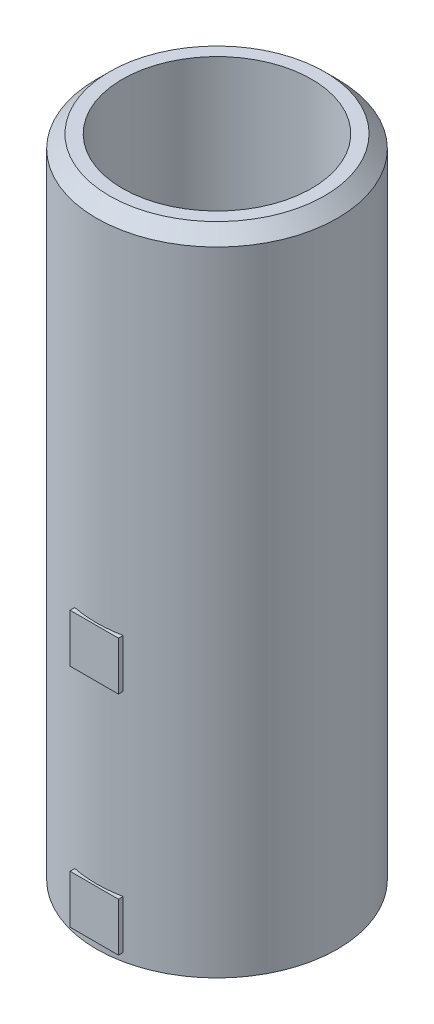
ISO-10303-21;
HEADER;
FILE_DESCRIPTION(('STEP AP214'),'2;1');
FILE_NAME('part.step','',(''),(''),'','','');
FILE_SCHEMA(('AUTOMOTIVE_DESIGN { 1 0 10303 214 1 1 1 1 }'));
ENDSEC;
DATA;
#1=APPLICATION_CONTEXT('core data for automotive mechanical design processes');
#2=APPLICATION_PROTOCOL_DEFINITION('international standard','automotive_design',2000,#1);
#3=PRODUCT_CONTEXT('',#1,'mechanical');
#4=PRODUCT('Part','Part','',(#3));
#5=PRODUCT_RELATED_PRODUCT_CATEGORY('part','',(#4));
#6=PRODUCT_DEFINITION_FORMATION('','',#4);
#7=PRODUCT_DEFINITION_CONTEXT('part definition',#1,'design');
#8=PRODUCT_DEFINITION('design','',#6,#7);
#9=PRODUCT_DEFINITION_SHAPE('','',#8);
#10=(LENGTH_UNIT() NAMED_UNIT(*) SI_UNIT(.MILLI.,.METRE.));
#11=(NAMED_UNIT(*) PLANE_ANGLE_UNIT() SI_UNIT($,.RADIAN.));
#12=(NAMED_UNIT(*) SI_UNIT($,.STERADIAN.) SOLID_ANGLE_UNIT());
#13=UNCERTAINTY_MEASURE_WITH_UNIT(LENGTH_MEASURE(1.E-05),#10,'distance_accuracy_value','');
#14=(GEOMETRIC_REPRESENTATION_CONTEXT(3) GLOBAL_UNCERTAINTY_ASSIGNED_CONTEXT((#13)) GLOBAL_UNIT_ASSIGNED_CONTEXT((#10,
#11,#12)) REPRESENTATION_CONTEXT('',''));
#15=CARTESIAN_POINT('',(0.,0.,0.));
#16=DIRECTION('',(0.,0.,1.));
#17=DIRECTION('',(1.,0.,0.));
#18=AXIS2_PLACEMENT_3D('',#15,#16,#17);
#19=CARTESIAN_POINT('',(0.,100.,0.));
#20=DIRECTION('',(0.,-1.,0.));
#21=DIRECTION('',(0.,0.,-1.));
#22=AXIS2_PLACEMENT_3D('',#19,#20,#21);
#23=CYLINDRICAL_SURFACE('',#22,18.65);
#24=CARTESIAN_POINT('',(0.,98.,0.));
#25=DIRECTION('',(0.,1.,0.));
#26=DIRECTION('',(0.,0.,1.));
#27=AXIS2_PLACEMENT_3D('',#24,#25,#26);
#28=CIRCLE('',#27,18.65);
#29=CARTESIAN_POINT('',(0.,98.,18.65));
#30=VERTEX_POINT('',#29);
#31=EDGE_CURVE('E11',#30,#30,#28,.F.);
#32=ORIENTED_EDGE('',*,*,#31,.T.);
#33=EDGE_LOOP('',(#32));
#34=FACE_BOUND('',#33,.T.);
#35=DIRECTION('',(0.,-1.,0.));
#36=VECTOR('',#35,1.);
#37=CARTESIAN_POINT('',(3.74999999999998,100.,18.2690995946708));
#38=LINE('',#37,#36);
#39=CARTESIAN_POINT('',(3.75,1.25,18.2690995946708));
#40=VERTEX_POINT('',#39);
#41=CARTESIAN_POINT('',(3.75,8.75000000000001,18.2690995946708));
#42=VERTEX_POINT('',#41);
#43=EDGE_CURVE('E164',#40,#42,#38,.F.);
#44=ORIENTED_EDGE('',*,*,#43,.F.);
#45=CARTESIAN_POINT('',(0.,1.25,0.));
#46=DIRECTION('',(0.,-1.,0.));
#47=DIRECTION('',(1.,0.,0.));
#48=AXIS2_PLACEMENT_3D('',#45,#46,#47);
#49=CIRCLE('',#48,18.65);
#50=CARTESIAN_POINT('',(-3.75,1.25,18.2690995946708));
#51=VERTEX_POINT('',#50);
#52=EDGE_CURVE('E168',#51,#40,#49,.F.);
#53=ORIENTED_EDGE('',*,*,#52,.F.);
#54=DIRECTION('',(0.,-1.,0.));
#55=VECTOR('',#54,1.);
#56=CARTESIAN_POINT('',(-3.75000000000002,100.,18.2690995946708));
#57=LINE('',#56,#55);
#58=CARTESIAN_POINT('',(-3.75000000000002,8.75000000000001,18.2690995946708));
#59=VERTEX_POINT('',#58);
#60=EDGE_CURVE('E175',#59,#51,#57,.T.);
#61=ORIENTED_EDGE('',*,*,#60,.F.);
#62=CARTESIAN_POINT('',(0.,8.75000000000001,0.));
#63=DIRECTION('',(0.,1.,0.));
#64=DIRECTION('',(0.,0.,1.));
#65=AXIS2_PLACEMENT_3D('',#62,#63,#64);
#66=CIRCLE('',#65,18.65);
#67=EDGE_CURVE('E169',#42,#59,#66,.F.);
#68=ORIENTED_EDGE('',*,*,#67,.F.);
#69=EDGE_LOOP('',(#44,#53,#61,#68));
#70=FACE_BOUND('',#69,.T.);
#71=CARTESIAN_POINT('',(0.,0.,0.));
#72=DIRECTION('',(0.,1.,0.));
#73=DIRECTION('',(0.,0.,1.));
#74=AXIS2_PLACEMENT_3D('',#71,#72,#73);
#75=CIRCLE('',#74,18.65);
#76=CARTESIAN_POINT('',(0.,0.,18.65));
#77=VERTEX_POINT('',#76);
#78=EDGE_CURVE('E233',#77,#77,#75,.T.);
#79=ORIENTED_EDGE('',*,*,#78,.T.);
#80=EDGE_LOOP('',(#79));
#81=FACE_BOUND('',#80,.T.);
#82=DIRECTION('',(0.,-1.,0.));
#83=VECTOR('',#82,1.);
#84=CARTESIAN_POINT('',(3.75,100.,18.2690995946708));
#85=LINE('',#84,#83);
#86=CARTESIAN_POINT('',(3.75,36.25,18.2690995946708));
#87=VERTEX_POINT('',#86);
#88=CARTESIAN_POINT('',(3.75,43.75,18.2690995946708));
#89=VERTEX_POINT('',#88);
#90=EDGE_CURVE('E166',#87,#89,#85,.F.);
#91=ORIENTED_EDGE('',*,*,#90,.F.);
#92=CARTESIAN_POINT('',(0.,36.25,0.));
#93=DIRECTION('',(0.,-1.,0.));
#94=DIRECTION('',(0.,0.,-1.));
#95=AXIS2_PLACEMENT_3D('',#92,#93,#94);
#96=CIRCLE('',#95,18.65);
#97=CARTESIAN_POINT('',(-3.75,36.25,18.2690995946708));
#98=VERTEX_POINT('',#97);
#99=EDGE_CURVE('E219',#98,#87,#96,.F.);
#100=ORIENTED_EDGE('',*,*,#99,.F.);
#101=DIRECTION('',(0.,-1.,0.));
#102=VECTOR('',#101,1.);
#103=CARTESIAN_POINT('',(-3.75,100.,18.2690995946708));
#104=LINE('',#103,#102);
#105=CARTESIAN_POINT('',(-3.75,43.75,18.2690995946708));
#106=VERTEX_POINT('',#105);
#107=EDGE_CURVE('E221',#106,#98,#104,.T.);
#108=ORIENTED_EDGE('',*,*,#107,.F.);
#109=CARTESIAN_POINT('',(0.,43.75,0.));
#110=DIRECTION('',(0.,1.,0.));
#111=DIRECTION('',(0.,0.,1.));
#112=AXIS2_PLACEMENT_3D('',#109,#110,#111);
#113=CIRCLE('',#112,18.65);
#114=EDGE_CURVE('E222',#89,#106,#113,.F.);
#115=ORIENTED_EDGE('',*,*,#114,.F.);
#116=EDGE_LOOP('',(#91,#100,#108,#115));
#117=FACE_BOUND('',#116,.T.);
#118=DIRECTION('',(0.,-1.,0.));
#119=VECTOR('',#118,1.);
#120=CARTESIAN_POINT('',(-3.75,100.,-18.2690995946708));
#121=LINE('',#120,#119);
#122=CARTESIAN_POINT('',(-3.75,36.25,-18.2690995946708));
#123=VERTEX_POINT('',#122);
#124=CARTESIAN_POINT('',(-3.75,43.75,-18.2690995946708));
#125=VERTEX_POINT('',#124);
#126=EDGE_CURVE('E126',#123,#125,#121,.F.);
#127=ORIENTED_EDGE('',*,*,#126,.F.);
#128=CARTESIAN_POINT('',(0.,36.25,0.));
#129=DIRECTION('',(0.,-1.,0.));
#130=DIRECTION('',(0.,0.,-1.));
#131=AXIS2_PLACEMENT_3D('',#128,#129,#130);
#132=CIRCLE('',#131,18.65);
#133=CARTESIAN_POINT('',(3.75,36.25,-18.2690995946708));
#134=VERTEX_POINT('',#133);
#135=EDGE_CURVE('E133',#134,#123,#132,.F.);
#136=ORIENTED_EDGE('',*,*,#135,.F.);
#137=DIRECTION('',(0.,-1.,0.));
#138=VECTOR('',#137,1.);
#139=CARTESIAN_POINT('',(3.75,100.,-18.2690995946708));
#140=LINE('',#139,#138);
#141=CARTESIAN_POINT('',(3.75,43.75,-18.2690995946708));
#142=VERTEX_POINT('',#141);
#143=EDGE_CURVE('E64',#142,#134,#140,.T.);
#144=ORIENTED_EDGE('',*,*,#143,.F.);
#145=CARTESIAN_POINT('',(0.,43.75,0.));
#146=DIRECTION('',(0.,1.,0.));
#147=DIRECTION('',(0.,0.,1.));
#148=AXIS2_PLACEMENT_3D('',#145,#146,#147);
#149=CIRCLE('',#148,18.65);
#150=EDGE_CURVE('E60',#125,#142,#149,.F.);
#151=ORIENTED_EDGE('',*,*,#150,.F.);
#152=EDGE_LOOP('',(#127,#136,#144,#151));
#153=FACE_BOUND('',#152,.T.);
#154=ADVANCED_FACE('F41',(#34,#70,#81,#117,#153),#23,.T.);
#155=CARTESIAN_POINT('',(0.,100.,0.));
#156=DIRECTION('',(0.,1.,0.));
#157=DIRECTION('',(0.,0.,1.));
#158=AXIS2_PLACEMENT_3D('',#155,#156,#157);
#159=PLANE('',#158);
#160=CARTESIAN_POINT('',(0.,100.,0.));
#161=DIRECTION('',(0.,1.,0.));
#162=DIRECTION('',(0.,0.,1.));
#163=AXIS2_PLACEMENT_3D('',#160,#161,#162);
#164=CIRCLE('',#163,16.65);
#165=CARTESIAN_POINT('',(0.,100.,16.65));
#166=VERTEX_POINT('',#165);
#167=EDGE_CURVE('E49',#166,#166,#164,.T.);
#168=ORIENTED_EDGE('',*,*,#167,.T.);
#169=EDGE_LOOP('',(#168));
#170=FACE_BOUND('',#169,.T.);
#171=CARTESIAN_POINT('',(0.,100.,0.));
#172=DIRECTION('',(0.,1.,0.));
#173=DIRECTION('',(0.,0.,1.));
#174=AXIS2_PLACEMENT_3D('',#171,#172,#173);
#175=CIRCLE('',#174,14.65);
#176=CARTESIAN_POINT('',(0.,100.,14.65));
#177=VERTEX_POINT('',#176);
#178=EDGE_CURVE('E234',#177,#177,#175,.T.);
#179=ORIENTED_EDGE('',*,*,#178,.F.);
#180=EDGE_LOOP('',(#179));
#181=FACE_BOUND('',#180,.T.);
#182=ADVANCED_FACE('F243',(#170,#181),#159,.T.);
#183=CARTESIAN_POINT('',(0.,0.,0.));
#184=DIRECTION('',(0.,1.,0.));
#185=DIRECTION('',(0.,0.,1.));
#186=AXIS2_PLACEMENT_3D('',#183,#184,#185);
#187=PLANE('',#186);
#188=ORIENTED_EDGE('',*,*,#78,.F.);
#189=EDGE_LOOP('',(#188));
#190=FACE_BOUND('',#189,.T.);
#191=CARTESIAN_POINT('',(0.,0.,0.));
#192=DIRECTION('',(0.,1.,0.));
#193=DIRECTION('',(0.,0.,1.));
#194=AXIS2_PLACEMENT_3D('',#191,#192,#193);
#195=CIRCLE('',#194,14.65);
#196=CARTESIAN_POINT('',(0.,0.,14.65));
#197=VERTEX_POINT('',#196);
#198=EDGE_CURVE('E200',#197,#197,#195,.T.);
#199=ORIENTED_EDGE('',*,*,#198,.T.);
#200=EDGE_LOOP('',(#199));
#201=FACE_BOUND('',#200,.T.);
#202=ADVANCED_FACE('F256',(#190,#201),#187,.F.);
#203=CARTESIAN_POINT('',(0.,100.,0.));
#204=DIRECTION('',(0.,-1.,0.));
#205=DIRECTION('',(0.,0.,-1.));
#206=AXIS2_PLACEMENT_3D('',#203,#204,#205);
#207=CYLINDRICAL_SURFACE('',#206,14.65);
#208=ORIENTED_EDGE('',*,*,#178,.T.);
#209=EDGE_LOOP('',(#208));
#210=FACE_BOUND('',#209,.T.);
#211=ORIENTED_EDGE('',*,*,#198,.F.);
#212=EDGE_LOOP('',(#211));
#213=FACE_BOUND('',#212,.T.);
#214=ADVANCED_FACE('F263',(#210,#213),#207,.F.);
#215=CARTESIAN_POINT('',(3.75,36.25,19.));
#216=DIRECTION('',(-1.,0.,0.));
#217=DIRECTION('',(0.,0.,1.));
#218=AXIS2_PLACEMENT_3D('',#215,#216,#217);
#219=PLANE('',#218);
#220=DIRECTION('',(0.,0.,-1.));
#221=VECTOR('',#220,1.);
#222=CARTESIAN_POINT('',(3.75,36.25,19.));
#223=LINE('',#222,#221);
#224=CARTESIAN_POINT('',(3.75,36.25,19.));
#225=VERTEX_POINT('',#224);
#226=EDGE_CURVE('E208',#225,#87,#223,.T.);
#227=ORIENTED_EDGE('',*,*,#226,.T.);
#228=ORIENTED_EDGE('',*,*,#90,.T.);
#229=DIRECTION('',(0.,0.,-1.));
#230=VECTOR('',#229,1.);
#231=CARTESIAN_POINT('',(3.75,43.75,19.));
#232=LINE('',#231,#230);
#233=CARTESIAN_POINT('',(3.75,43.75,19.));
#234=VERTEX_POINT('',#233);
#235=EDGE_CURVE('E163',#234,#89,#232,.T.);
#236=ORIENTED_EDGE('',*,*,#235,.F.);
#237=DIRECTION('',(0.,1.,0.));
#238=VECTOR('',#237,1.);
#239=CARTESIAN_POINT('',(3.75,36.25,19.));
#240=LINE('',#239,#238);
#241=EDGE_CURVE('E220',#225,#234,#240,.T.);
#242=ORIENTED_EDGE('',*,*,#241,.F.);
#243=EDGE_LOOP('',(#227,#228,#236,#242));
#244=FACE_BOUND('',#243,.T.);
#245=ADVANCED_FACE('F268',(#244),#219,.F.);
#246=CARTESIAN_POINT('',(-3.75,43.75,19.));
#247=DIRECTION('',(0.,-1.,0.));
#248=DIRECTION('',(0.,0.,-1.));
#249=AXIS2_PLACEMENT_3D('',#246,#247,#248);
#250=PLANE('',#249);
#251=ORIENTED_EDGE('',*,*,#235,.T.);
#252=ORIENTED_EDGE('',*,*,#114,.T.);
#253=DIRECTION('',(0.,0.,-1.));
#254=VECTOR('',#253,1.);
#255=CARTESIAN_POINT('',(-3.75,43.75,19.));
#256=LINE('',#255,#254);
#257=CARTESIAN_POINT('',(-3.75,43.75,19.));
#258=VERTEX_POINT('',#257);
#259=EDGE_CURVE('E205',#258,#106,#256,.T.);
#260=ORIENTED_EDGE('',*,*,#259,.F.);
#261=DIRECTION('',(-1.,0.,0.));
#262=VECTOR('',#261,1.);
#263=CARTESIAN_POINT('',(-3.75,43.75,19.));
#264=LINE('',#263,#262);
#265=EDGE_CURVE('E214',#234,#258,#264,.T.);
#266=ORIENTED_EDGE('',*,*,#265,.F.);
#267=EDGE_LOOP('',(#251,#252,#260,#266));
#268=FACE_BOUND('',#267,.T.);
#269=ADVANCED_FACE('F284',(#268),#250,.F.);
#270=CARTESIAN_POINT('',(-3.75,36.25,19.));
#271=DIRECTION('',(1.,0.,0.));
#272=DIRECTION('',(0.,0.,-1.));
#273=AXIS2_PLACEMENT_3D('',#270,#271,#272);
#274=PLANE('',#273);
#275=ORIENTED_EDGE('',*,*,#259,.T.);
#276=ORIENTED_EDGE('',*,*,#107,.T.);
#277=DIRECTION('',(0.,0.,-1.));
#278=VECTOR('',#277,1.);
#279=CARTESIAN_POINT('',(-3.75,36.25,19.));
#280=LINE('',#279,#278);
#281=CARTESIAN_POINT('',(-3.75,36.25,19.));
#282=VERTEX_POINT('',#281);
#283=EDGE_CURVE('E202',#282,#98,#280,.T.);
#284=ORIENTED_EDGE('',*,*,#283,.F.);
#285=DIRECTION('',(0.,-1.,0.));
#286=VECTOR('',#285,1.);
#287=CARTESIAN_POINT('',(-3.75,36.25,19.));
#288=LINE('',#287,#286);
#289=EDGE_CURVE('E213',#258,#282,#288,.T.);
#290=ORIENTED_EDGE('',*,*,#289,.F.);
#291=EDGE_LOOP('',(#275,#276,#284,#290));
#292=FACE_BOUND('',#291,.T.);
#293=ADVANCED_FACE('F279',(#292),#274,.F.);
#294=CARTESIAN_POINT('',(-3.75,36.25,19.));
#295=DIRECTION('',(0.,1.,0.));
#296=DIRECTION('',(0.,0.,1.));
#297=AXIS2_PLACEMENT_3D('',#294,#295,#296);
#298=PLANE('',#297);
#299=ORIENTED_EDGE('',*,*,#283,.T.);
#300=ORIENTED_EDGE('',*,*,#99,.T.);
#301=ORIENTED_EDGE('',*,*,#226,.F.);
#302=DIRECTION('',(1.,0.,0.));
#303=VECTOR('',#302,1.);
#304=CARTESIAN_POINT('',(-3.75,36.25,19.));
#305=LINE('',#304,#303);
#306=EDGE_CURVE('E211',#282,#225,#305,.T.);
#307=ORIENTED_EDGE('',*,*,#306,.F.);
#308=EDGE_LOOP('',(#299,#300,#301,#307));
#309=FACE_BOUND('',#308,.T.);
#310=ADVANCED_FACE('F273',(#309),#298,.F.);
#311=CARTESIAN_POINT('',(0.,0.,19.));
#312=DIRECTION('',(0.,0.,-1.));
#313=DIRECTION('',(-1.,0.,0.));
#314=AXIS2_PLACEMENT_3D('',#311,#312,#313);
#315=PLANE('',#314);
#316=ORIENTED_EDGE('',*,*,#241,.T.);
#317=ORIENTED_EDGE('',*,*,#265,.T.);
#318=ORIENTED_EDGE('',*,*,#289,.T.);
#319=ORIENTED_EDGE('',*,*,#306,.T.);
#320=EDGE_LOOP('',(#316,#317,#318,#319));
#321=FACE_BOUND('',#320,.T.);
#322=ADVANCED_FACE('F269',(#321),#315,.F.);
#323=CARTESIAN_POINT('',(3.75,1.25,19.));
#324=DIRECTION('',(-1.,0.,0.));
#325=DIRECTION('',(0.,-1.,0.));
#326=AXIS2_PLACEMENT_3D('',#323,#324,#325);
#327=PLANE('',#326);
#328=DIRECTION('',(0.,0.,-1.));
#329=VECTOR('',#328,1.);
#330=CARTESIAN_POINT('',(3.75,1.25,19.));
#331=LINE('',#330,#329);
#332=CARTESIAN_POINT('',(3.75,1.25,19.));
#333=VERTEX_POINT('',#332);
#334=EDGE_CURVE('E189',#333,#40,#331,.T.);
#335=ORIENTED_EDGE('',*,*,#334,.T.);
#336=ORIENTED_EDGE('',*,*,#43,.T.);
#337=DIRECTION('',(0.,0.,-1.));
#338=VECTOR('',#337,1.);
#339=CARTESIAN_POINT('',(3.75,8.75,19.));
#340=LINE('',#339,#338);
#341=CARTESIAN_POINT('',(3.75,8.75,19.));
#342=VERTEX_POINT('',#341);
#343=EDGE_CURVE('E198',#342,#42,#340,.T.);
#344=ORIENTED_EDGE('',*,*,#343,.F.);
#345=DIRECTION('',(0.,1.,0.));
#346=VECTOR('',#345,1.);
#347=CARTESIAN_POINT('',(3.75,1.25,19.));
#348=LINE('',#347,#346);
#349=EDGE_CURVE('E172',#333,#342,#348,.T.);
#350=ORIENTED_EDGE('',*,*,#349,.F.);
#351=EDGE_LOOP('',(#335,#336,#344,#350));
#352=FACE_BOUND('',#351,.T.);
#353=ADVANCED_FACE('F272',(#352),#327,.F.);
#354=CARTESIAN_POINT('',(-3.75,8.75,19.));
#355=DIRECTION('',(0.,-1.,0.));
#356=DIRECTION('',(0.,0.,-1.));
#357=AXIS2_PLACEMENT_3D('',#354,#355,#356);
#358=PLANE('',#357);
#359=ORIENTED_EDGE('',*,*,#343,.T.);
#360=ORIENTED_EDGE('',*,*,#67,.T.);
#361=DIRECTION('',(0.,0.,-1.));
#362=VECTOR('',#361,1.);
#363=CARTESIAN_POINT('',(-3.75,8.75,19.));
#364=LINE('',#363,#362);
#365=CARTESIAN_POINT('',(-3.75,8.75,19.));
#366=VERTEX_POINT('',#365);
#367=EDGE_CURVE('E195',#366,#59,#364,.T.);
#368=ORIENTED_EDGE('',*,*,#367,.F.);
#369=DIRECTION('',(-1.,0.,0.));
#370=VECTOR('',#369,1.);
#371=CARTESIAN_POINT('',(-3.75,8.75,19.));
#372=LINE('',#371,#370);
#373=EDGE_CURVE('E182',#342,#366,#372,.T.);
#374=ORIENTED_EDGE('',*,*,#373,.F.);
#375=EDGE_LOOP('',(#359,#360,#368,#374));
#376=FACE_BOUND('',#375,.T.);
#377=ADVANCED_FACE('F295',(#376),#358,.F.);
#378=CARTESIAN_POINT('',(-3.75,1.25,19.));
#379=DIRECTION('',(1.,0.,0.));
#380=DIRECTION('',(0.,1.,0.));
#381=AXIS2_PLACEMENT_3D('',#378,#379,#380);
#382=PLANE('',#381);
#383=ORIENTED_EDGE('',*,*,#367,.T.);
#384=ORIENTED_EDGE('',*,*,#60,.T.);
#385=DIRECTION('',(0.,0.,-1.));
#386=VECTOR('',#385,1.);
#387=CARTESIAN_POINT('',(-3.75,1.25,19.));
#388=LINE('',#387,#386);
#389=CARTESIAN_POINT('',(-3.75,1.25,19.));
#390=VERTEX_POINT('',#389);
#391=EDGE_CURVE('E186',#390,#51,#388,.T.);
#392=ORIENTED_EDGE('',*,*,#391,.F.);
#393=DIRECTION('',(0.,-1.,0.));
#394=VECTOR('',#393,1.);
#395=CARTESIAN_POINT('',(-3.75,1.25,19.));
#396=LINE('',#395,#394);
#397=EDGE_CURVE('E181',#366,#390,#396,.T.);
#398=ORIENTED_EDGE('',*,*,#397,.F.);
#399=EDGE_LOOP('',(#383,#384,#392,#398));
#400=FACE_BOUND('',#399,.T.);
#401=ADVANCED_FACE('F298',(#400),#382,.F.);
#402=CARTESIAN_POINT('',(-3.75,1.25,19.));
#403=DIRECTION('',(0.,1.,0.));
#404=DIRECTION('',(-1.,0.,0.));
#405=AXIS2_PLACEMENT_3D('',#402,#403,#404);
#406=PLANE('',#405);
#407=ORIENTED_EDGE('',*,*,#391,.T.);
#408=ORIENTED_EDGE('',*,*,#52,.T.);
#409=ORIENTED_EDGE('',*,*,#334,.F.);
#410=DIRECTION('',(1.,0.,0.));
#411=VECTOR('',#410,1.);
#412=CARTESIAN_POINT('',(-3.75,1.25,19.));
#413=LINE('',#412,#411);
#414=EDGE_CURVE('E183',#390,#333,#413,.T.);
#415=ORIENTED_EDGE('',*,*,#414,.F.);
#416=EDGE_LOOP('',(#407,#408,#409,#415));
#417=FACE_BOUND('',#416,.T.);
#418=ADVANCED_FACE('F296',(#417),#406,.F.);
#419=CARTESIAN_POINT('',(0.,0.,19.));
#420=DIRECTION('',(0.,0.,-1.));
#421=DIRECTION('',(-1.,0.,0.));
#422=AXIS2_PLACEMENT_3D('',#419,#420,#421);
#423=PLANE('',#422);
#424=ORIENTED_EDGE('',*,*,#349,.T.);
#425=ORIENTED_EDGE('',*,*,#373,.T.);
#426=ORIENTED_EDGE('',*,*,#397,.T.);
#427=ORIENTED_EDGE('',*,*,#414,.T.);
#428=EDGE_LOOP('',(#424,#425,#426,#427));
#429=FACE_BOUND('',#428,.T.);
#430=ADVANCED_FACE('F303',(#429),#423,.F.);
#431=CARTESIAN_POINT('',(-3.75,36.25,-19.));
#432=DIRECTION('',(1.,0.,0.));
#433=DIRECTION('',(0.,0.,-1.));
#434=AXIS2_PLACEMENT_3D('',#431,#432,#433);
#435=PLANE('',#434);
#436=DIRECTION('',(0.,0.,1.));
#437=VECTOR('',#436,1.);
#438=CARTESIAN_POINT('',(-3.75,36.25,-19.));
#439=LINE('',#438,#437);
#440=CARTESIAN_POINT('',(-3.75,36.25,-19.));
#441=VERTEX_POINT('',#440);
#442=EDGE_CURVE('E140',#441,#123,#439,.T.);
#443=ORIENTED_EDGE('',*,*,#442,.T.);
#444=ORIENTED_EDGE('',*,*,#126,.T.);
#445=DIRECTION('',(0.,0.,1.));
#446=VECTOR('',#445,1.);
#447=CARTESIAN_POINT('',(-3.75,43.75,-19.));
#448=LINE('',#447,#446);
#449=CARTESIAN_POINT('',(-3.75,43.75,-19.));
#450=VERTEX_POINT('',#449);
#451=EDGE_CURVE('E165',#450,#125,#448,.T.);
#452=ORIENTED_EDGE('',*,*,#451,.F.);
#453=DIRECTION('',(0.,1.,0.));
#454=VECTOR('',#453,1.);
#455=CARTESIAN_POINT('',(-3.75,36.25,-19.));
#456=LINE('',#455,#454);
#457=EDGE_CURVE('E143',#441,#450,#456,.T.);
#458=ORIENTED_EDGE('',*,*,#457,.F.);
#459=EDGE_LOOP('',(#443,#444,#452,#458));
#460=FACE_BOUND('',#459,.T.);
#461=ADVANCED_FACE('F138',(#460),#435,.F.);
#462=CARTESIAN_POINT('',(-3.75,43.75,-19.));
#463=DIRECTION('',(0.,-1.,0.));
#464=DIRECTION('',(0.,0.,-1.));
#465=AXIS2_PLACEMENT_3D('',#462,#463,#464);
#466=PLANE('',#465);
#467=ORIENTED_EDGE('',*,*,#451,.T.);
#468=ORIENTED_EDGE('',*,*,#150,.T.);
#469=DIRECTION('',(0.,0.,1.));
#470=VECTOR('',#469,1.);
#471=CARTESIAN_POINT('',(3.75,43.75,-19.));
#472=LINE('',#471,#470);
#473=CARTESIAN_POINT('',(3.75,43.75,-19.));
#474=VERTEX_POINT('',#473);
#475=EDGE_CURVE('E159',#474,#142,#472,.T.);
#476=ORIENTED_EDGE('',*,*,#475,.F.);
#477=DIRECTION('',(1.,0.,0.));
#478=VECTOR('',#477,1.);
#479=CARTESIAN_POINT('',(-3.75,43.75,-19.));
#480=LINE('',#479,#478);
#481=EDGE_CURVE('E152',#450,#474,#480,.T.);
#482=ORIENTED_EDGE('',*,*,#481,.F.);
#483=EDGE_LOOP('',(#467,#468,#476,#482));
#484=FACE_BOUND('',#483,.T.);
#485=ADVANCED_FACE('F313',(#484),#466,.F.);
#486=CARTESIAN_POINT('',(3.75,43.75,-19.));
#487=DIRECTION('',(-1.,0.,0.));
#488=DIRECTION('',(0.,0.,1.));
#489=AXIS2_PLACEMENT_3D('',#486,#487,#488);
#490=PLANE('',#489);
#491=ORIENTED_EDGE('',*,*,#475,.T.);
#492=ORIENTED_EDGE('',*,*,#143,.T.);
#493=DIRECTION('',(0.,0.,1.));
#494=VECTOR('',#493,1.);
#495=CARTESIAN_POINT('',(3.75,36.25,-19.));
#496=LINE('',#495,#494);
#497=CARTESIAN_POINT('',(3.75,36.25,-19.));
#498=VERTEX_POINT('',#497);
#499=EDGE_CURVE('E145',#498,#134,#496,.T.);
#500=ORIENTED_EDGE('',*,*,#499,.F.);
#501=DIRECTION('',(0.,-1.,0.));
#502=VECTOR('',#501,1.);
#503=CARTESIAN_POINT('',(3.75,43.75,-19.));
#504=LINE('',#503,#502);
#505=EDGE_CURVE('E156',#474,#498,#504,.T.);
#506=ORIENTED_EDGE('',*,*,#505,.F.);
#507=EDGE_LOOP('',(#491,#492,#500,#506));
#508=FACE_BOUND('',#507,.T.);
#509=ADVANCED_FACE('F314',(#508),#490,.F.);
#510=CARTESIAN_POINT('',(3.75,36.25,-19.));
#511=DIRECTION('',(0.,1.,0.));
#512=DIRECTION('',(0.,0.,1.));
#513=AXIS2_PLACEMENT_3D('',#510,#511,#512);
#514=PLANE('',#513);
#515=ORIENTED_EDGE('',*,*,#499,.T.);
#516=ORIENTED_EDGE('',*,*,#135,.T.);
#517=ORIENTED_EDGE('',*,*,#442,.F.);
#518=DIRECTION('',(-1.,0.,0.));
#519=VECTOR('',#518,1.);
#520=CARTESIAN_POINT('',(3.75,36.25,-19.));
#521=LINE('',#520,#519);
#522=EDGE_CURVE('E144',#498,#441,#521,.T.);
#523=ORIENTED_EDGE('',*,*,#522,.F.);
#524=EDGE_LOOP('',(#515,#516,#517,#523));
#525=FACE_BOUND('',#524,.T.);
#526=ADVANCED_FACE('F150',(#525),#514,.F.);
#527=CARTESIAN_POINT('',(0.,0.,-19.));
#528=DIRECTION('',(0.,0.,-1.));
#529=DIRECTION('',(-1.,0.,0.));
#530=AXIS2_PLACEMENT_3D('',#527,#528,#529);
#531=PLANE('',#530);
#532=ORIENTED_EDGE('',*,*,#457,.T.);
#533=ORIENTED_EDGE('',*,*,#481,.T.);
#534=ORIENTED_EDGE('',*,*,#505,.T.);
#535=ORIENTED_EDGE('',*,*,#522,.T.);
#536=EDGE_LOOP('',(#532,#533,#534,#535));
#537=FACE_BOUND('',#536,.T.);
#538=ADVANCED_FACE('F241',(#537),#531,.T.);
#539=CARTESIAN_POINT('',(0.,100.,0.));
#540=DIRECTION('',(0.,-1.,0.));
#541=DIRECTION('',(0.,0.,-1.));
#542=AXIS2_PLACEMENT_3D('',#539,#540,#541);
#543=CONICAL_SURFACE('',#542,16.65,0.785398163397448);
#544=ORIENTED_EDGE('',*,*,#31,.F.);
#545=EDGE_LOOP('',(#544));
#546=FACE_BOUND('',#545,.T.);
#547=ORIENTED_EDGE('',*,*,#167,.F.);
#548=EDGE_LOOP('',(#547));
#549=FACE_BOUND('',#548,.T.);
#550=ADVANCED_FACE('F42',(#546,#549),#543,.T.);
#551=CLOSED_SHELL('',(#154,#182,#202,#214,#245,#269,#293,#310,#322,#353,#377,#401,#418,#430,
#461,#485,#509,#526,#538,#550));
#552=MANIFOLD_SOLID_BREP('B2',#551);
#553=ADVANCED_BREP_SHAPE_REPRESENTATION('',(#18,#552),#14);
#554=SHAPE_DEFINITION_REPRESENTATION(#9,#553);
ENDSEC;
END-ISO-10303-21;
